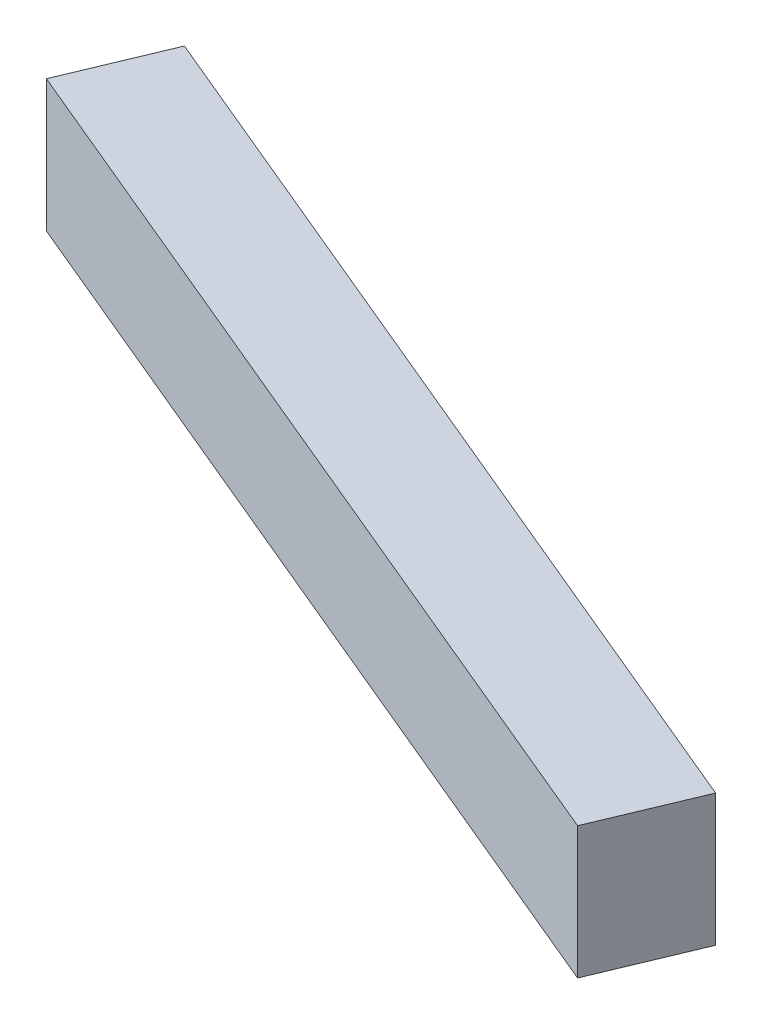
ISO-10303-21;
HEADER;
FILE_DESCRIPTION(('STEP AP214'),'2;1');
FILE_NAME('part.step','',(''),(''),'','','');
FILE_SCHEMA(('AUTOMOTIVE_DESIGN { 1 0 10303 214 1 1 1 1 }'));
ENDSEC;
DATA;
#1=APPLICATION_CONTEXT('core data for automotive mechanical design processes');
#2=APPLICATION_PROTOCOL_DEFINITION('international standard','automotive_design',2000,#1);
#3=PRODUCT_CONTEXT('',#1,'mechanical');
#4=PRODUCT('Part','Part','',(#3));
#5=PRODUCT_RELATED_PRODUCT_CATEGORY('part','',(#4));
#6=PRODUCT_DEFINITION_FORMATION('','',#4);
#7=PRODUCT_DEFINITION_CONTEXT('part definition',#1,'design');
#8=PRODUCT_DEFINITION('design','',#6,#7);
#9=PRODUCT_DEFINITION_SHAPE('','',#8);
#10=(LENGTH_UNIT() NAMED_UNIT(*) SI_UNIT(.MILLI.,.METRE.));
#11=(NAMED_UNIT(*) PLANE_ANGLE_UNIT() SI_UNIT($,.RADIAN.));
#12=(NAMED_UNIT(*) SI_UNIT($,.STERADIAN.) SOLID_ANGLE_UNIT());
#13=UNCERTAINTY_MEASURE_WITH_UNIT(LENGTH_MEASURE(1.E-05),#10,'distance_accuracy_value','');
#14=(GEOMETRIC_REPRESENTATION_CONTEXT(3) GLOBAL_UNCERTAINTY_ASSIGNED_CONTEXT((#13)) GLOBAL_UNIT_ASSIGNED_CONTEXT((#10,
#11,#12)) REPRESENTATION_CONTEXT('',''));
#15=CARTESIAN_POINT('',(0.,0.,0.));
#16=DIRECTION('',(0.,0.,1.));
#17=DIRECTION('',(1.,0.,0.));
#18=AXIS2_PLACEMENT_3D('',#15,#16,#17);
#19=CARTESIAN_POINT('',(-16.6438753254775,7.874,-6.84593510758319));
#20=DIRECTION('',(0.385562520602211,0.,-0.922681712567703));
#21=DIRECTION('',(-0.922681712567703,0.,-0.385562520602211));
#22=AXIS2_PLACEMENT_3D('',#19,#20,#21);
#23=PLANE('',#22);
#24=DIRECTION('',(0.,1.,0.));
#25=VECTOR('',#24,1.);
#26=CARTESIAN_POINT('',(-16.6438753254775,7.874,-6.84593510758319));
#27=LINE('',#26,#25);
#28=CARTESIAN_POINT('',(-16.6438753254775,7.62,-6.84593510758319));
#29=VERTEX_POINT('',#28);
#30=CARTESIAN_POINT('',(-16.6438753254775,7.874,-6.84593510758319));
#31=VERTEX_POINT('',#30);
#32=EDGE_CURVE('E20',#29,#31,#27,.T.);
#33=ORIENTED_EDGE('',*,*,#32,.T.);
#34=DIRECTION('',(-0.922681712567706,0.,-0.385562520602205));
#35=VECTOR('',#34,1.);
#36=CARTESIAN_POINT('',(-16.6438753254775,7.874,-6.84593510758319));
#37=LINE('',#36,#35);
#38=CARTESIAN_POINT('',(-18.401583987919,7.874,-7.5804317093304));
#39=VERTEX_POINT('',#38);
#40=EDGE_CURVE('E55',#31,#39,#37,.T.);
#41=ORIENTED_EDGE('',*,*,#40,.T.);
#42=DIRECTION('',(0.,1.,0.));
#43=VECTOR('',#42,1.);
#44=CARTESIAN_POINT('',(-18.401583987919,7.874,-7.5804317093304));
#45=LINE('',#44,#43);
#46=CARTESIAN_POINT('',(-18.401583987919,7.62,-7.58043170933041));
#47=VERTEX_POINT('',#46);
#48=EDGE_CURVE('E76',#39,#47,#45,.F.);
#49=ORIENTED_EDGE('',*,*,#48,.T.);
#50=DIRECTION('',(-0.922681712567706,0.,-0.385562520602205));
#51=VECTOR('',#50,1.);
#52=CARTESIAN_POINT('',(-16.6438753254775,7.62,-6.84593510758319));
#53=LINE('',#52,#51);
#54=EDGE_CURVE('E58',#29,#47,#53,.T.);
#55=ORIENTED_EDGE('',*,*,#54,.F.);
#56=EDGE_LOOP('',(#33,#41,#49,#55));
#57=FACE_BOUND('',#56,.T.);
#58=ADVANCED_FACE('F17',(#57),#23,.F.);
#59=CARTESIAN_POINT('',(-16.6438753254775,7.874,-6.84593510758319));
#60=DIRECTION('',(-0.922681712567711,0.,-0.385562520602192));
#61=DIRECTION('',(-0.385562520602192,0.,0.922681712567711));
#62=AXIS2_PLACEMENT_3D('',#59,#60,#61);
#63=PLANE('',#62);
#64=DIRECTION('',(0.,1.,0.));
#65=VECTOR('',#64,1.);
#66=CARTESIAN_POINT('',(-16.5655290212911,7.874,-7.03342403157695));
#67=LINE('',#66,#65);
#68=CARTESIAN_POINT('',(-16.5655290212911,7.62,-7.03342403157696));
#69=VERTEX_POINT('',#68);
#70=CARTESIAN_POINT('',(-16.5655290212911,7.874,-7.03342403157696));
#71=VERTEX_POINT('',#70);
#72=EDGE_CURVE('E73',#69,#71,#67,.T.);
#73=ORIENTED_EDGE('',*,*,#72,.T.);
#74=DIRECTION('',(-0.385562520602329,0.,0.922681712567654));
#75=VECTOR('',#74,1.);
#76=CARTESIAN_POINT('',(-16.5655290212911,7.874,-7.03342403157695));
#77=LINE('',#76,#75);
#78=EDGE_CURVE('E63',#71,#31,#77,.T.);
#79=ORIENTED_EDGE('',*,*,#78,.T.);
#80=ORIENTED_EDGE('',*,*,#32,.F.);
#81=DIRECTION('',(-0.385562520602329,0.,0.922681712567654));
#82=VECTOR('',#81,1.);
#83=CARTESIAN_POINT('',(-16.5655290212911,7.62,-7.03342403157695));
#84=LINE('',#83,#82);
#85=EDGE_CURVE('E80',#69,#29,#84,.T.);
#86=ORIENTED_EDGE('',*,*,#85,.F.);
#87=EDGE_LOOP('',(#73,#79,#80,#86));
#88=FACE_BOUND('',#87,.T.);
#89=ADVANCED_FACE('F72',(#88),#63,.F.);
#90=CARTESIAN_POINT('',(-16.6438753254775,7.874,-6.84593510758319));
#91=DIRECTION('',(0.,-1.,0.));
#92=DIRECTION('',(0.,0.,-1.));
#93=AXIS2_PLACEMENT_3D('',#90,#91,#92);
#94=PLANE('',#93);
#95=ORIENTED_EDGE('',*,*,#78,.F.);
#96=DIRECTION('',(0.922681712567703,0.,0.385562520602211));
#97=VECTOR('',#96,1.);
#98=CARTESIAN_POINT('',(-16.5655290212911,7.874,-7.03342403157695));
#99=LINE('',#98,#97);
#100=CARTESIAN_POINT('',(-18.323237684018,7.874,-7.76792063344344));
#101=VERTEX_POINT('',#100);
#102=EDGE_CURVE('E83',#71,#101,#99,.F.);
#103=ORIENTED_EDGE('',*,*,#102,.T.);
#104=DIRECTION('',(0.385562519197595,0.,-0.922681713154652));
#105=VECTOR('',#104,1.);
#106=CARTESIAN_POINT('',(-18.401583987919,7.874,-7.5804317093304));
#107=LINE('',#106,#105);
#108=EDGE_CURVE('E69',#101,#39,#107,.F.);
#109=ORIENTED_EDGE('',*,*,#108,.T.);
#110=ORIENTED_EDGE('',*,*,#40,.F.);
#111=EDGE_LOOP('',(#95,#103,#109,#110));
#112=FACE_BOUND('',#111,.T.);
#113=ADVANCED_FACE('F66',(#112),#94,.F.);
#114=CARTESIAN_POINT('',(-18.401583987919,7.874,-7.5804317093304));
#115=DIRECTION('',(0.922681713154652,0.,0.385562519197595));
#116=DIRECTION('',(0.385562519197595,0.,-0.922681713154652));
#117=AXIS2_PLACEMENT_3D('',#114,#115,#116);
#118=PLANE('',#117);
#119=ORIENTED_EDGE('',*,*,#48,.F.);
#120=ORIENTED_EDGE('',*,*,#108,.F.);
#121=DIRECTION('',(0.,1.,0.));
#122=VECTOR('',#121,1.);
#123=CARTESIAN_POINT('',(-18.323237684018,7.874,-7.76792063344343));
#124=LINE('',#123,#122);
#125=CARTESIAN_POINT('',(-18.323237684018,7.62,-7.76792063344344));
#126=VERTEX_POINT('',#125);
#127=EDGE_CURVE('E26',#101,#126,#124,.F.);
#128=ORIENTED_EDGE('',*,*,#127,.T.);
#129=DIRECTION('',(0.385562519197781,0.,-0.922681713154575));
#130=VECTOR('',#129,1.);
#131=CARTESIAN_POINT('',(-18.401583987919,7.62,-7.5804317093304));
#132=LINE('',#131,#130);
#133=EDGE_CURVE('E34',#47,#126,#132,.T.);
#134=ORIENTED_EDGE('',*,*,#133,.F.);
#135=EDGE_LOOP('',(#119,#120,#128,#134));
#136=FACE_BOUND('',#135,.T.);
#137=ADVANCED_FACE('F88',(#136),#118,.F.);
#138=CARTESIAN_POINT('',(-16.6438753254775,7.62,-6.84593510758319));
#139=DIRECTION('',(0.,-1.,0.));
#140=DIRECTION('',(0.,0.,-1.));
#141=AXIS2_PLACEMENT_3D('',#138,#139,#140);
#142=PLANE('',#141);
#143=DIRECTION('',(0.922681712567703,0.,0.385562520602211));
#144=VECTOR('',#143,1.);
#145=CARTESIAN_POINT('',(-16.5655290212911,7.62,-7.03342403157695));
#146=LINE('',#145,#144);
#147=EDGE_CURVE('E11',#126,#69,#146,.T.);
#148=ORIENTED_EDGE('',*,*,#147,.T.);
#149=ORIENTED_EDGE('',*,*,#85,.T.);
#150=ORIENTED_EDGE('',*,*,#54,.T.);
#151=ORIENTED_EDGE('',*,*,#133,.T.);
#152=EDGE_LOOP('',(#148,#149,#150,#151));
#153=FACE_BOUND('',#152,.T.);
#154=ADVANCED_FACE('F91',(#153),#142,.T.);
#155=CARTESIAN_POINT('',(-16.5655290212911,7.874,-7.03342403157695));
#156=DIRECTION('',(-0.385562520602211,0.,0.922681712567703));
#157=DIRECTION('',(0.922681712567703,0.,0.385562520602211));
#158=AXIS2_PLACEMENT_3D('',#155,#156,#157);
#159=PLANE('',#158);
#160=ORIENTED_EDGE('',*,*,#127,.F.);
#161=ORIENTED_EDGE('',*,*,#102,.F.);
#162=ORIENTED_EDGE('',*,*,#72,.F.);
#163=ORIENTED_EDGE('',*,*,#147,.F.);
#164=EDGE_LOOP('',(#160,#161,#162,#163));
#165=FACE_BOUND('',#164,.T.);
#166=ADVANCED_FACE('F90',(#165),#159,.F.);
#167=CLOSED_SHELL('',(#58,#89,#113,#137,#154,#166));
#168=MANIFOLD_SOLID_BREP('B1',#167);
#169=ADVANCED_BREP_SHAPE_REPRESENTATION('',(#18,#168),#14);
#170=SHAPE_DEFINITION_REPRESENTATION(#9,#169);
ENDSEC;
END-ISO-10303-21;
